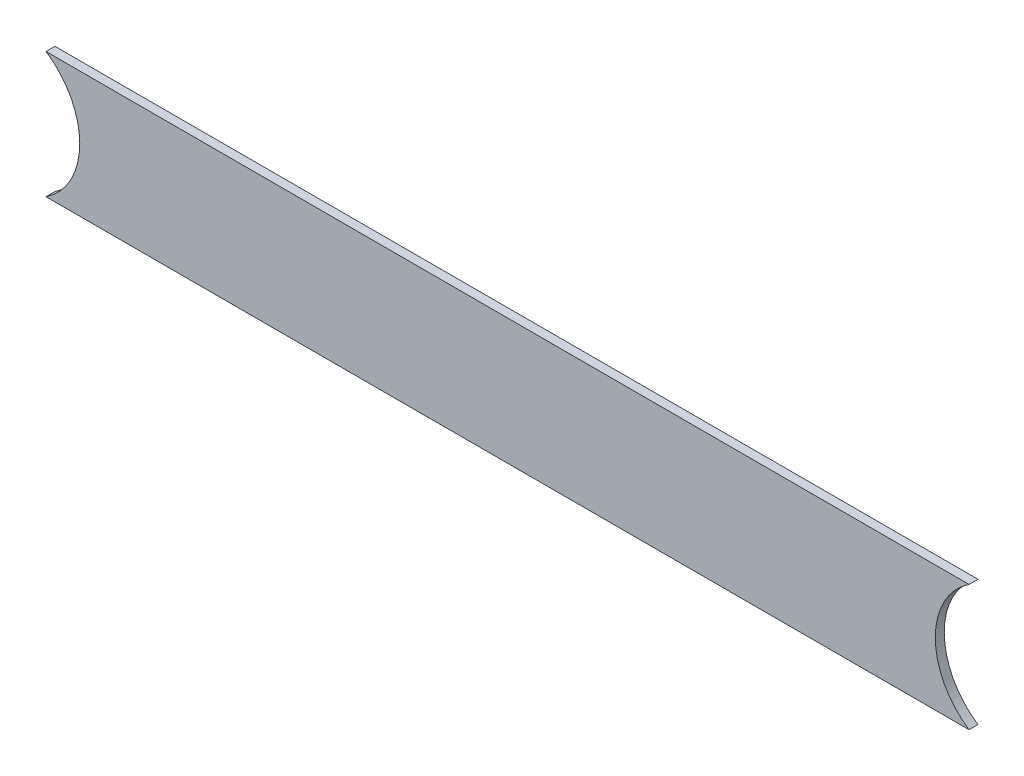
ISO-10303-21;
HEADER;
FILE_DESCRIPTION(('STEP AP214'),'2;1');
FILE_NAME('part.step','',(''),(''),'','','');
FILE_SCHEMA(('AUTOMOTIVE_DESIGN { 1 0 10303 214 1 1 1 1 }'));
ENDSEC;
DATA;
#1=APPLICATION_CONTEXT('core data for automotive mechanical design processes');
#2=APPLICATION_PROTOCOL_DEFINITION('international standard','automotive_design',2000,#1);
#3=PRODUCT_CONTEXT('',#1,'mechanical');
#4=PRODUCT('Part','Part','',(#3));
#5=PRODUCT_RELATED_PRODUCT_CATEGORY('part','',(#4));
#6=PRODUCT_DEFINITION_FORMATION('','',#4);
#7=PRODUCT_DEFINITION_CONTEXT('part definition',#1,'design');
#8=PRODUCT_DEFINITION('design','',#6,#7);
#9=PRODUCT_DEFINITION_SHAPE('','',#8);
#10=(LENGTH_UNIT() NAMED_UNIT(*) SI_UNIT(.MILLI.,.METRE.));
#11=(NAMED_UNIT(*) PLANE_ANGLE_UNIT() SI_UNIT($,.RADIAN.));
#12=(NAMED_UNIT(*) SI_UNIT($,.STERADIAN.) SOLID_ANGLE_UNIT());
#13=UNCERTAINTY_MEASURE_WITH_UNIT(LENGTH_MEASURE(1.E-05),#10,'distance_accuracy_value','');
#14=(GEOMETRIC_REPRESENTATION_CONTEXT(3) GLOBAL_UNCERTAINTY_ASSIGNED_CONTEXT((#13)) GLOBAL_UNIT_ASSIGNED_CONTEXT((#10,
#11,#12)) REPRESENTATION_CONTEXT('',''));
#15=CARTESIAN_POINT('',(0.,0.,0.));
#16=DIRECTION('',(0.,0.,1.));
#17=DIRECTION('',(1.,0.,0.));
#18=AXIS2_PLACEMENT_3D('',#15,#16,#17);
#19=CARTESIAN_POINT('',(97.5658393078553,112.25000156,0.));
#20=DIRECTION('',(0.,1.,0.));
#21=DIRECTION('',(1.,0.,0.));
#22=AXIS2_PLACEMENT_3D('',#19,#20,#21);
#23=PLANE('',#22);
#24=DIRECTION('',(1.,0.,0.));
#25=VECTOR('',#24,1.);
#26=CARTESIAN_POINT('',(97.4000084,112.25000156,0.03556));
#27=LINE('',#26,#25);
#28=CARTESIAN_POINT('',(97.5658393078553,112.25000156,0.03556));
#29=VERTEX_POINT('',#28);
#30=CARTESIAN_POINT('',(101.234189812145,112.25000156,0.03556));
#31=VERTEX_POINT('',#30);
#32=EDGE_CURVE('E11',#29,#31,#27,.T.);
#33=ORIENTED_EDGE('',*,*,#32,.F.);
#34=DIRECTION('',(0.,0.,1.));
#35=VECTOR('',#34,1.);
#36=CARTESIAN_POINT('',(97.5658393078553,112.25000156,0.));
#37=LINE('',#36,#35);
#38=CARTESIAN_POINT('',(97.5658393078553,112.25000156,0.));
#39=VERTEX_POINT('',#38);
#40=EDGE_CURVE('E24',#39,#29,#37,.T.);
#41=ORIENTED_EDGE('',*,*,#40,.F.);
#42=DIRECTION('',(1.,0.,0.));
#43=VECTOR('',#42,1.);
#44=CARTESIAN_POINT('',(97.4000084,112.25000156,0.));
#45=LINE('',#44,#43);
#46=CARTESIAN_POINT('',(101.234189812145,112.25000156,0.));
#47=VERTEX_POINT('',#46);
#48=EDGE_CURVE('E82',#39,#47,#45,.T.);
#49=ORIENTED_EDGE('',*,*,#48,.T.);
#50=DIRECTION('',(0.,0.,1.));
#51=VECTOR('',#50,1.);
#52=CARTESIAN_POINT('',(101.234189812145,112.25000156,0.));
#53=LINE('',#52,#51);
#54=EDGE_CURVE('E37',#47,#31,#53,.T.);
#55=ORIENTED_EDGE('',*,*,#54,.T.);
#56=EDGE_LOOP('',(#33,#41,#49,#55));
#57=FACE_BOUND('',#56,.T.);
#58=ADVANCED_FACE('F17',(#57),#23,.F.);
#59=CARTESIAN_POINT('',(101.40002072,112.50000106,0.));
#60=DIRECTION('',(0.,0.,-1.));
#61=DIRECTION('',(1.,0.,0.));
#62=AXIS2_PLACEMENT_3D('',#59,#60,#61);
#63=CYLINDRICAL_SURFACE('',#62,0.2999994);
#64=DIRECTION('',(0.,0.,1.));
#65=VECTOR('',#64,1.);
#66=CARTESIAN_POINT('',(101.234189812145,112.75000056,0.));
#67=LINE('',#66,#65);
#68=CARTESIAN_POINT('',(101.234189812145,112.75000056,0.));
#69=VERTEX_POINT('',#68);
#70=CARTESIAN_POINT('',(101.234189812145,112.75000056,0.03556));
#71=VERTEX_POINT('',#70);
#72=EDGE_CURVE('E97',#69,#71,#67,.T.);
#73=ORIENTED_EDGE('',*,*,#72,.T.);
#74=CARTESIAN_POINT('',(101.40002072,112.50000106,0.03556));
#75=DIRECTION('',(0.,0.,1.));
#76=DIRECTION('',(1.,0.,0.));
#77=AXIS2_PLACEMENT_3D('',#74,#75,#76);
#78=CIRCLE('',#77,0.2999994);
#79=EDGE_CURVE('E94',#71,#31,#78,.T.);
#80=ORIENTED_EDGE('',*,*,#79,.T.);
#81=ORIENTED_EDGE('',*,*,#54,.F.);
#82=CARTESIAN_POINT('',(101.40002072,112.50000106,0.));
#83=DIRECTION('',(0.,0.,1.));
#84=DIRECTION('',(1.,0.,0.));
#85=AXIS2_PLACEMENT_3D('',#82,#83,#84);
#86=CIRCLE('',#85,0.2999994);
#87=EDGE_CURVE('E92',#69,#47,#86,.T.);
#88=ORIENTED_EDGE('',*,*,#87,.F.);
#89=EDGE_LOOP('',(#73,#80,#81,#88));
#90=FACE_BOUND('',#89,.T.);
#91=ADVANCED_FACE('F102',(#90),#63,.F.);
#92=CARTESIAN_POINT('',(101.234189812145,112.75000056,0.));
#93=DIRECTION('',(0.,-1.,0.));
#94=DIRECTION('',(-1.,0.,0.));
#95=AXIS2_PLACEMENT_3D('',#92,#93,#94);
#96=PLANE('',#95);
#97=DIRECTION('',(-1.,0.,0.));
#98=VECTOR('',#97,1.);
#99=CARTESIAN_POINT('',(101.40002072,112.75000056,0.03556));
#100=LINE('',#99,#98);
#101=CARTESIAN_POINT('',(97.5658393078553,112.75000056,0.03556));
#102=VERTEX_POINT('',#101);
#103=EDGE_CURVE('E89',#71,#102,#100,.T.);
#104=ORIENTED_EDGE('',*,*,#103,.F.);
#105=ORIENTED_EDGE('',*,*,#72,.F.);
#106=DIRECTION('',(-1.,0.,0.));
#107=VECTOR('',#106,1.);
#108=CARTESIAN_POINT('',(101.40002072,112.75000056,0.));
#109=LINE('',#108,#107);
#110=CARTESIAN_POINT('',(97.5658393078553,112.75000056,0.));
#111=VERTEX_POINT('',#110);
#112=EDGE_CURVE('E87',#69,#111,#109,.T.);
#113=ORIENTED_EDGE('',*,*,#112,.T.);
#114=DIRECTION('',(0.,0.,1.));
#115=VECTOR('',#114,1.);
#116=CARTESIAN_POINT('',(97.5658393078553,112.75000056,0.));
#117=LINE('',#116,#115);
#118=EDGE_CURVE('E69',#111,#102,#117,.T.);
#119=ORIENTED_EDGE('',*,*,#118,.T.);
#120=EDGE_LOOP('',(#104,#105,#113,#119));
#121=FACE_BOUND('',#120,.T.);
#122=ADVANCED_FACE('F108',(#121),#96,.F.);
#123=CARTESIAN_POINT('',(97.4000084,112.50000106,0.));
#124=DIRECTION('',(0.,0.,-1.));
#125=DIRECTION('',(1.,0.,0.));
#126=AXIS2_PLACEMENT_3D('',#123,#124,#125);
#127=CYLINDRICAL_SURFACE('',#126,0.2999994);
#128=DIRECTION('',(0.,0.,1.));
#129=VECTOR('',#128,1.);
#130=CARTESIAN_POINT('',(97.7000078,112.50000106,0.));
#131=LINE('',#130,#129);
#132=CARTESIAN_POINT('',(97.7000078,112.50000106,0.));
#133=VERTEX_POINT('',#132);
#134=CARTESIAN_POINT('',(97.7000078,112.50000106,0.03556));
#135=VERTEX_POINT('',#134);
#136=EDGE_CURVE('E59',#133,#135,#131,.T.);
#137=ORIENTED_EDGE('',*,*,#136,.T.);
#138=CARTESIAN_POINT('',(97.4000084,112.50000106,0.03556));
#139=DIRECTION('',(0.,0.,1.));
#140=DIRECTION('',(1.,0.,0.));
#141=AXIS2_PLACEMENT_3D('',#138,#139,#140);
#142=CIRCLE('',#141,0.2999994);
#143=EDGE_CURVE('E70',#135,#102,#142,.T.);
#144=ORIENTED_EDGE('',*,*,#143,.T.);
#145=ORIENTED_EDGE('',*,*,#118,.F.);
#146=CARTESIAN_POINT('',(97.4000084,112.50000106,0.));
#147=DIRECTION('',(0.,0.,1.));
#148=DIRECTION('',(1.,0.,0.));
#149=AXIS2_PLACEMENT_3D('',#146,#147,#148);
#150=CIRCLE('',#149,0.2999994);
#151=EDGE_CURVE('E73',#133,#111,#150,.T.);
#152=ORIENTED_EDGE('',*,*,#151,.F.);
#153=EDGE_LOOP('',(#137,#144,#145,#152));
#154=FACE_BOUND('',#153,.T.);
#155=ADVANCED_FACE('F74',(#154),#127,.F.);
#156=CARTESIAN_POINT('',(97.4000084,112.50000106,0.));
#157=DIRECTION('',(0.,0.,-1.));
#158=DIRECTION('',(1.,0.,0.));
#159=AXIS2_PLACEMENT_3D('',#156,#157,#158);
#160=CYLINDRICAL_SURFACE('',#159,0.2999994);
#161=ORIENTED_EDGE('',*,*,#40,.T.);
#162=CARTESIAN_POINT('',(97.4000084,112.50000106,0.03556));
#163=DIRECTION('',(0.,0.,1.));
#164=DIRECTION('',(1.,0.,0.));
#165=AXIS2_PLACEMENT_3D('',#162,#163,#164);
#166=CIRCLE('',#165,0.2999994);
#167=EDGE_CURVE('E65',#29,#135,#166,.T.);
#168=ORIENTED_EDGE('',*,*,#167,.T.);
#169=ORIENTED_EDGE('',*,*,#136,.F.);
#170=EDGE_CURVE('E63',#39,#133,#150,.T.);
#171=ORIENTED_EDGE('',*,*,#170,.F.);
#172=EDGE_LOOP('',(#161,#168,#169,#171));
#173=FACE_BOUND('',#172,.T.);
#174=ADVANCED_FACE('F61',(#173),#160,.F.);
#175=CARTESIAN_POINT('',(97.4000084,112.25000156,0.));
#176=DIRECTION('',(0.,0.,-1.));
#177=DIRECTION('',(-1.,0.,0.));
#178=AXIS2_PLACEMENT_3D('',#175,#176,#177);
#179=PLANE('',#178);
#180=ORIENTED_EDGE('',*,*,#48,.F.);
#181=ORIENTED_EDGE('',*,*,#170,.T.);
#182=ORIENTED_EDGE('',*,*,#151,.T.);
#183=ORIENTED_EDGE('',*,*,#112,.F.);
#184=ORIENTED_EDGE('',*,*,#87,.T.);
#185=EDGE_LOOP('',(#180,#181,#182,#183,#184));
#186=FACE_BOUND('',#185,.T.);
#187=ADVANCED_FACE('F80',(#186),#179,.T.);
#188=CARTESIAN_POINT('',(97.4000084,112.25000156,0.03556));
#189=DIRECTION('',(0.,0.,-1.));
#190=DIRECTION('',(-1.,0.,0.));
#191=AXIS2_PLACEMENT_3D('',#188,#189,#190);
#192=PLANE('',#191);
#193=ORIENTED_EDGE('',*,*,#167,.F.);
#194=ORIENTED_EDGE('',*,*,#32,.T.);
#195=ORIENTED_EDGE('',*,*,#79,.F.);
#196=ORIENTED_EDGE('',*,*,#103,.T.);
#197=ORIENTED_EDGE('',*,*,#143,.F.);
#198=EDGE_LOOP('',(#193,#194,#195,#196,#197));
#199=FACE_BOUND('',#198,.T.);
#200=ADVANCED_FACE('F106',(#199),#192,.F.);
#201=CLOSED_SHELL('',(#58,#91,#122,#155,#174,#187,#200));
#202=MANIFOLD_SOLID_BREP('B1',#201);
#203=ADVANCED_BREP_SHAPE_REPRESENTATION('',(#18,#202),#14);
#204=SHAPE_DEFINITION_REPRESENTATION(#9,#203);
ENDSEC;
END-ISO-10303-21;
